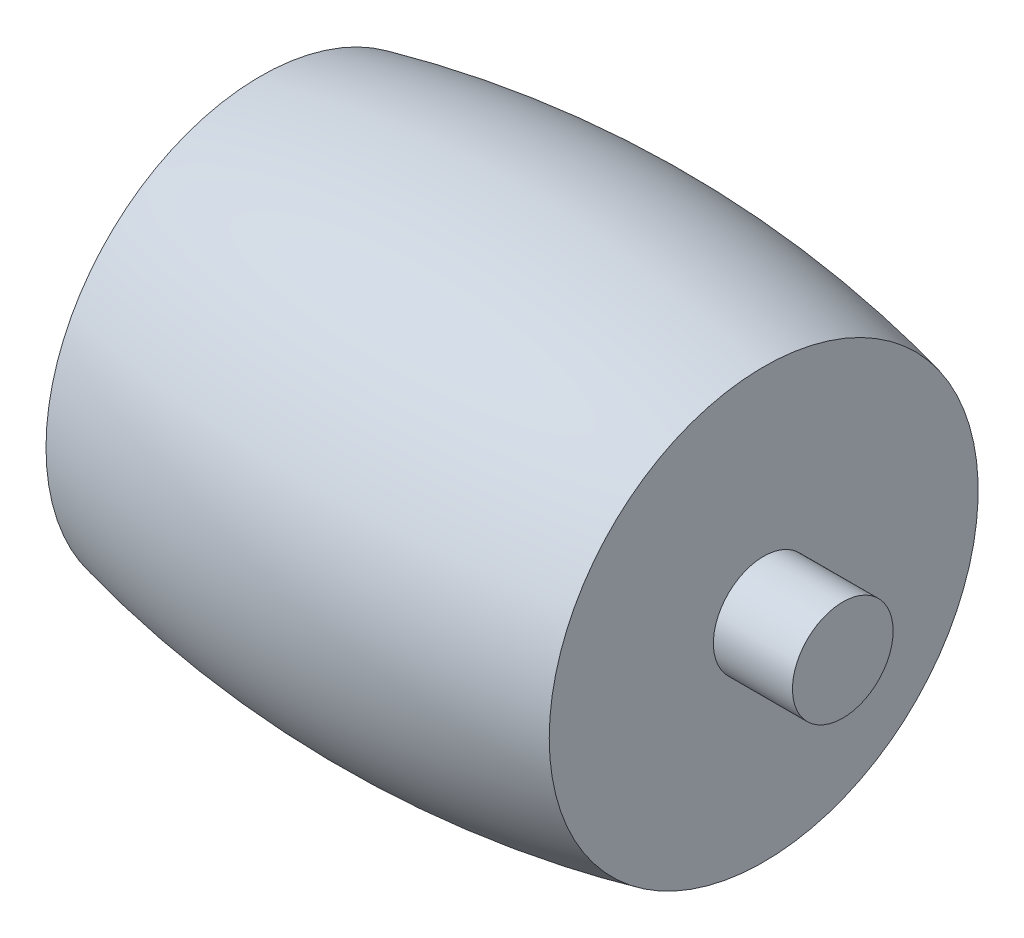
ISO-10303-21;
HEADER;
FILE_DESCRIPTION(('STEP AP214'),'2;1');
FILE_NAME('part.step','',(''),(''),'','','');
FILE_SCHEMA(('AUTOMOTIVE_DESIGN { 1 0 10303 214 1 1 1 1 }'));
ENDSEC;
DATA;
#1=APPLICATION_CONTEXT('core data for automotive mechanical design processes');
#2=APPLICATION_PROTOCOL_DEFINITION('international standard','automotive_design',2000,#1);
#3=PRODUCT_CONTEXT('',#1,'mechanical');
#4=PRODUCT('Part','Part','',(#3));
#5=PRODUCT_RELATED_PRODUCT_CATEGORY('part','',(#4));
#6=PRODUCT_DEFINITION_FORMATION('','',#4);
#7=PRODUCT_DEFINITION_CONTEXT('part definition',#1,'design');
#8=PRODUCT_DEFINITION('design','',#6,#7);
#9=PRODUCT_DEFINITION_SHAPE('','',#8);
#10=(LENGTH_UNIT() NAMED_UNIT(*) SI_UNIT(.MILLI.,.METRE.));
#11=(NAMED_UNIT(*) PLANE_ANGLE_UNIT() SI_UNIT($,.RADIAN.));
#12=(NAMED_UNIT(*) SI_UNIT($,.STERADIAN.) SOLID_ANGLE_UNIT());
#13=UNCERTAINTY_MEASURE_WITH_UNIT(LENGTH_MEASURE(1.E-05),#10,'distance_accuracy_value','');
#14=(GEOMETRIC_REPRESENTATION_CONTEXT(3) GLOBAL_UNCERTAINTY_ASSIGNED_CONTEXT((#13)) GLOBAL_UNIT_ASSIGNED_CONTEXT((#10,
#11,#12)) REPRESENTATION_CONTEXT('',''));
#15=CARTESIAN_POINT('',(0.,0.,0.));
#16=DIRECTION('',(0.,0.,1.));
#17=DIRECTION('',(1.,0.,0.));
#18=AXIS2_PLACEMENT_3D('',#15,#16,#17);
#19=CARTESIAN_POINT('',(-18.415,0.,0.));
#20=DIRECTION('',(1.,0.,0.));
#21=DIRECTION('',(0.,0.,-1.));
#22=AXIS2_PLACEMENT_3D('',#19,#20,#21);
#23=PLANE('',#22);
#24=CARTESIAN_POINT('',(-18.415,0.,0.));
#25=DIRECTION('',(1.,0.,0.));
#26=DIRECTION('',(0.,0.,-1.));
#27=AXIS2_PLACEMENT_3D('',#24,#25,#26);
#28=CIRCLE('',#27,3.683);
#29=CARTESIAN_POINT('',(-18.415,0.,-3.683));
#30=VERTEX_POINT('',#29);
#31=EDGE_CURVE('E58',#30,#30,#28,.T.);
#32=ORIENTED_EDGE('',*,*,#31,.T.);
#33=EDGE_LOOP('',(#32));
#34=FACE_BOUND('',#33,.T.);
#35=CARTESIAN_POINT('',(-18.415,0.,0.));
#36=DIRECTION('',(-1.,0.,0.));
#37=DIRECTION('',(0.,0.,1.));
#38=AXIS2_PLACEMENT_3D('',#35,#36,#37);
#39=CIRCLE('',#38,15.6975725106249);
#40=CARTESIAN_POINT('',(-18.415,0.,15.6975725106249));
#41=VERTEX_POINT('',#40);
#42=EDGE_CURVE('E38',#41,#41,#39,.T.);
#43=ORIENTED_EDGE('',*,*,#42,.T.);
#44=EDGE_LOOP('',(#43));
#45=FACE_BOUND('',#44,.T.);
#46=ADVANCED_FACE('F35',(#34,#45),#23,.F.);
#47=CARTESIAN_POINT('',(0.,0.,0.));
#48=DIRECTION('',(-1.,0.,0.));
#49=DIRECTION('',(0.,0.,1.));
#50=AXIS2_PLACEMENT_3D('',#47,#48,#49);
#51=DEGENERATE_TOROIDAL_SURFACE('',#50,64.683550592,82.463550592,.F.);
#52=ORIENTED_EDGE('',*,*,#42,.F.);
#53=EDGE_LOOP('',(#52));
#54=FACE_BOUND('',#53,.T.);
#55=CARTESIAN_POINT('',(18.415,0.,0.));
#56=DIRECTION('',(-1.,0.,0.));
#57=DIRECTION('',(0.,0.,1.));
#58=AXIS2_PLACEMENT_3D('',#55,#56,#57);
#59=CIRCLE('',#58,15.6975725106249);
#60=CARTESIAN_POINT('',(18.415,0.,15.6975725106249));
#61=VERTEX_POINT('',#60);
#62=EDGE_CURVE('E46',#61,#61,#59,.T.);
#63=ORIENTED_EDGE('',*,*,#62,.T.);
#64=EDGE_LOOP('',(#63));
#65=FACE_BOUND('',#64,.T.);
#66=ADVANCED_FACE('F81',(#54,#65),#51,.F.);
#67=CARTESIAN_POINT('',(18.415,0.,0.));
#68=DIRECTION('',(-1.,0.,0.));
#69=DIRECTION('',(0.,0.,1.));
#70=AXIS2_PLACEMENT_3D('',#67,#68,#69);
#71=PLANE('',#70);
#72=CARTESIAN_POINT('',(18.415,0.,0.));
#73=DIRECTION('',(1.,0.,0.));
#74=DIRECTION('',(0.,0.,-1.));
#75=AXIS2_PLACEMENT_3D('',#72,#73,#74);
#76=CIRCLE('',#75,3.683);
#77=CARTESIAN_POINT('',(18.415,0.,-3.683));
#78=VERTEX_POINT('',#77);
#79=EDGE_CURVE('E10',#78,#78,#76,.T.);
#80=ORIENTED_EDGE('',*,*,#79,.F.);
#81=EDGE_LOOP('',(#80));
#82=FACE_BOUND('',#81,.T.);
#83=ORIENTED_EDGE('',*,*,#62,.F.);
#84=EDGE_LOOP('',(#83));
#85=FACE_BOUND('',#84,.T.);
#86=ADVANCED_FACE('F85',(#82,#85),#71,.F.);
#87=CARTESIAN_POINT('',(24.204022458,0.,0.));
#88=DIRECTION('',(-1.,0.,0.));
#89=DIRECTION('',(0.,0.,1.));
#90=AXIS2_PLACEMENT_3D('',#87,#88,#89);
#91=CYLINDRICAL_SURFACE('',#90,3.683);
#92=CARTESIAN_POINT('',(24.204022458,0.,0.));
#93=DIRECTION('',(1.,0.,0.));
#94=DIRECTION('',(0.,0.,-1.));
#95=AXIS2_PLACEMENT_3D('',#92,#93,#94);
#96=CIRCLE('',#95,3.683);
#97=CARTESIAN_POINT('',(24.204022458,0.,-3.683));
#98=VERTEX_POINT('',#97);
#99=EDGE_CURVE('E48',#98,#98,#96,.T.);
#100=ORIENTED_EDGE('',*,*,#99,.F.);
#101=EDGE_LOOP('',(#100));
#102=FACE_BOUND('',#101,.T.);
#103=ORIENTED_EDGE('',*,*,#79,.T.);
#104=EDGE_LOOP('',(#103));
#105=FACE_BOUND('',#104,.T.);
#106=ADVANCED_FACE('F78',(#102,#105),#91,.T.);
#107=CARTESIAN_POINT('',(24.204022458,0.,0.));
#108=DIRECTION('',(1.,0.,0.));
#109=DIRECTION('',(0.,0.,-1.));
#110=AXIS2_PLACEMENT_3D('',#107,#108,#109);
#111=PLANE('',#110);
#112=ORIENTED_EDGE('',*,*,#99,.T.);
#113=EDGE_LOOP('',(#112));
#114=FACE_BOUND('',#113,.T.);
#115=ADVANCED_FACE('F70',(#114),#111,.T.);
#116=CARTESIAN_POINT('',(-24.204022458,0.,0.));
#117=DIRECTION('',(1.,0.,0.));
#118=DIRECTION('',(0.,0.,-1.));
#119=AXIS2_PLACEMENT_3D('',#116,#117,#118);
#120=CYLINDRICAL_SURFACE('',#119,3.683);
#121=CARTESIAN_POINT('',(-24.204022458,0.,0.));
#122=DIRECTION('',(1.,0.,0.));
#123=DIRECTION('',(0.,0.,-1.));
#124=AXIS2_PLACEMENT_3D('',#121,#122,#123);
#125=CIRCLE('',#124,3.683);
#126=CARTESIAN_POINT('',(-24.204022458,0.,-3.683));
#127=VERTEX_POINT('',#126);
#128=EDGE_CURVE('E54',#127,#127,#125,.T.);
#129=ORIENTED_EDGE('',*,*,#128,.T.);
#130=EDGE_LOOP('',(#129));
#131=FACE_BOUND('',#130,.T.);
#132=ORIENTED_EDGE('',*,*,#31,.F.);
#133=EDGE_LOOP('',(#132));
#134=FACE_BOUND('',#133,.T.);
#135=ADVANCED_FACE('F67',(#131,#134),#120,.T.);
#136=CARTESIAN_POINT('',(-24.204022458,0.,0.));
#137=DIRECTION('',(-1.,0.,0.));
#138=DIRECTION('',(0.,0.,-1.));
#139=AXIS2_PLACEMENT_3D('',#136,#137,#138);
#140=PLANE('',#139);
#141=ORIENTED_EDGE('',*,*,#128,.F.);
#142=EDGE_LOOP('',(#141));
#143=FACE_BOUND('',#142,.T.);
#144=ADVANCED_FACE('F69',(#143),#140,.T.);
#145=CLOSED_SHELL('',(#46,#66,#86,#106,#115,#135,#144));
#146=MANIFOLD_SOLID_BREP('B2',#145);
#147=ADVANCED_BREP_SHAPE_REPRESENTATION('',(#18,#146),#14);
#148=SHAPE_DEFINITION_REPRESENTATION(#9,#147);
ENDSEC;
END-ISO-10303-21;
